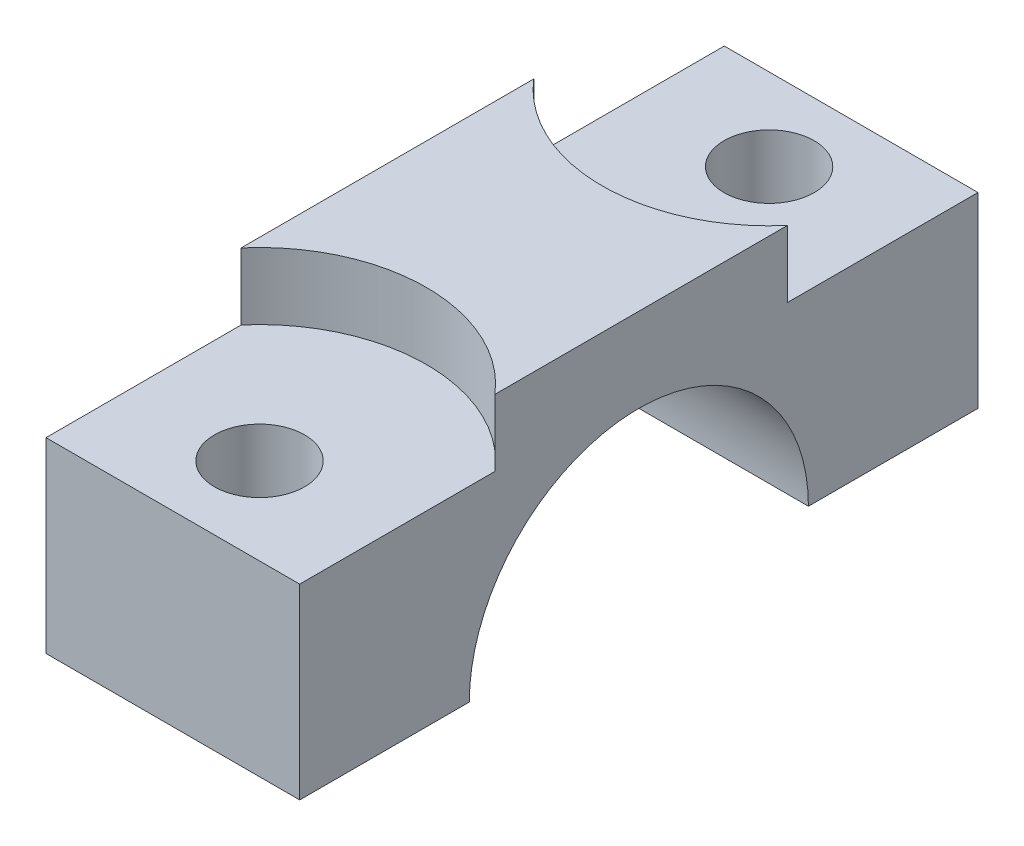
ISO-10303-21;
HEADER;
FILE_DESCRIPTION(('STEP AP214'),'2;1');
FILE_NAME('part.step','',(''),(''),'','','');
FILE_SCHEMA(('AUTOMOTIVE_DESIGN { 1 0 10303 214 1 1 1 1 }'));
ENDSEC;
DATA;
#1=APPLICATION_CONTEXT('core data for automotive mechanical design processes');
#2=APPLICATION_PROTOCOL_DEFINITION('international standard','automotive_design',2000,#1);
#3=PRODUCT_CONTEXT('',#1,'mechanical');
#4=PRODUCT('Part','Part','',(#3));
#5=PRODUCT_RELATED_PRODUCT_CATEGORY('part','',(#4));
#6=PRODUCT_DEFINITION_FORMATION('','',#4);
#7=PRODUCT_DEFINITION_CONTEXT('part definition',#1,'design');
#8=PRODUCT_DEFINITION('design','',#6,#7);
#9=PRODUCT_DEFINITION_SHAPE('','',#8);
#10=(LENGTH_UNIT() NAMED_UNIT(*) SI_UNIT(.MILLI.,.METRE.));
#11=(NAMED_UNIT(*) PLANE_ANGLE_UNIT() SI_UNIT($,.RADIAN.));
#12=(NAMED_UNIT(*) SI_UNIT($,.STERADIAN.) SOLID_ANGLE_UNIT());
#13=UNCERTAINTY_MEASURE_WITH_UNIT(LENGTH_MEASURE(1.E-05),#10,'distance_accuracy_value','');
#14=(GEOMETRIC_REPRESENTATION_CONTEXT(3) GLOBAL_UNCERTAINTY_ASSIGNED_CONTEXT((#13)) GLOBAL_UNIT_ASSIGNED_CONTEXT((#10,
#11,#12)) REPRESENTATION_CONTEXT('',''));
#15=CARTESIAN_POINT('',(0.,0.,0.));
#16=DIRECTION('',(0.,0.,1.));
#17=DIRECTION('',(1.,0.,0.));
#18=AXIS2_PLACEMENT_3D('',#15,#16,#17);
#19=CARTESIAN_POINT('',(9.5,19.,25.4));
#20=DIRECTION('',(0.,-1.,0.));
#21=DIRECTION('',(0.,0.,-1.));
#22=AXIS2_PLACEMENT_3D('',#19,#20,#21);
#23=PLANE('',#22);
#24=DIRECTION('',(0.,0.,1.));
#25=VECTOR('',#24,1.);
#26=CARTESIAN_POINT('',(9.5,19.,25.4));
#27=LINE('',#26,#25);
#28=CARTESIAN_POINT('',(9.5,19.,-11.1304294252436));
#29=VERTEX_POINT('',#28);
#30=CARTESIAN_POINT('',(9.5,19.,10.7841993951461));
#31=VERTEX_POINT('',#30);
#32=EDGE_CURVE('E194',#29,#31,#27,.T.);
#33=ORIENTED_EDGE('',*,*,#32,.F.);
#34=CARTESIAN_POINT('',(0.,19.,-19.2544678298796));
#35=DIRECTION('',(0.,1.,0.));
#36=DIRECTION('',(0.,0.,1.));
#37=AXIS2_PLACEMENT_3D('',#34,#35,#36);
#38=CIRCLE('',#37,12.5);
#39=CARTESIAN_POINT('',(-9.5,19.,-11.1304294252436));
#40=VERTEX_POINT('',#39);
#41=EDGE_CURVE('E247',#40,#29,#38,.T.);
#42=ORIENTED_EDGE('',*,*,#41,.F.);
#43=DIRECTION('',(0.,0.,1.));
#44=VECTOR('',#43,1.);
#45=CARTESIAN_POINT('',(-9.5,19.,25.4));
#46=LINE('',#45,#44);
#47=CARTESIAN_POINT('',(-9.5,19.,10.7841993951461));
#48=VERTEX_POINT('',#47);
#49=EDGE_CURVE('E181',#40,#48,#46,.T.);
#50=ORIENTED_EDGE('',*,*,#49,.T.);
#51=CARTESIAN_POINT('',(0.,19.,18.908237799782));
#52=DIRECTION('',(0.,1.,0.));
#53=DIRECTION('',(0.,0.,1.));
#54=AXIS2_PLACEMENT_3D('',#51,#52,#53);
#55=CIRCLE('',#54,12.5);
#56=EDGE_CURVE('E152',#31,#48,#55,.T.);
#57=ORIENTED_EDGE('',*,*,#56,.F.);
#58=EDGE_LOOP('',(#33,#42,#50,#57));
#59=FACE_BOUND('',#58,.T.);
#60=ADVANCED_FACE('F41',(#59),#23,.F.);
#61=CARTESIAN_POINT('',(9.5,19.,25.4));
#62=DIRECTION('',(0.,0.,-1.));
#63=DIRECTION('',(0.,1.,0.));
#64=AXIS2_PLACEMENT_3D('',#61,#62,#63);
#65=PLANE('',#64);
#66=DIRECTION('',(0.,-1.,0.));
#67=VECTOR('',#66,1.);
#68=CARTESIAN_POINT('',(9.5,19.,25.4));
#69=LINE('',#68,#67);
#70=CARTESIAN_POINT('',(9.5,14.,25.4));
#71=VERTEX_POINT('',#70);
#72=CARTESIAN_POINT('',(9.5,0.,25.4));
#73=VERTEX_POINT('',#72);
#74=EDGE_CURVE('E177',#71,#73,#69,.T.);
#75=ORIENTED_EDGE('',*,*,#74,.F.);
#76=DIRECTION('',(-1.,0.,0.));
#77=VECTOR('',#76,1.);
#78=CARTESIAN_POINT('',(9.5,14.,25.4));
#79=LINE('',#78,#77);
#80=CARTESIAN_POINT('',(-9.5,14.,25.4));
#81=VERTEX_POINT('',#80);
#82=EDGE_CURVE('E169',#71,#81,#79,.T.);
#83=ORIENTED_EDGE('',*,*,#82,.T.);
#84=DIRECTION('',(0.,-1.,0.));
#85=VECTOR('',#84,1.);
#86=CARTESIAN_POINT('',(-9.5,19.,25.4));
#87=LINE('',#86,#85);
#88=CARTESIAN_POINT('',(-9.5,0.,25.4));
#89=VERTEX_POINT('',#88);
#90=EDGE_CURVE('E176',#81,#89,#87,.T.);
#91=ORIENTED_EDGE('',*,*,#90,.T.);
#92=DIRECTION('',(-1.,0.,0.));
#93=VECTOR('',#92,1.);
#94=CARTESIAN_POINT('',(9.5,0.,25.4));
#95=LINE('',#94,#93);
#96=EDGE_CURVE('E226',#73,#89,#95,.T.);
#97=ORIENTED_EDGE('',*,*,#96,.F.);
#98=EDGE_LOOP('',(#75,#83,#91,#97));
#99=FACE_BOUND('',#98,.T.);
#100=ADVANCED_FACE('F43',(#99),#65,.F.);
#101=CARTESIAN_POINT('',(9.5,0.,25.4));
#102=DIRECTION('',(0.,1.,0.));
#103=DIRECTION('',(0.,0.,1.));
#104=AXIS2_PLACEMENT_3D('',#101,#102,#103);
#105=PLANE('',#104);
#106=DIRECTION('',(0.,0.,-1.));
#107=VECTOR('',#106,1.);
#108=CARTESIAN_POINT('',(-9.5,0.,25.4));
#109=LINE('',#108,#107);
#110=CARTESIAN_POINT('',(-9.5,0.,12.7));
#111=VERTEX_POINT('',#110);
#112=EDGE_CURVE('E200',#89,#111,#109,.T.);
#113=ORIENTED_EDGE('',*,*,#112,.T.);
#114=DIRECTION('',(-1.,0.,0.));
#115=VECTOR('',#114,1.);
#116=CARTESIAN_POINT('',(9.5,0.,12.7));
#117=LINE('',#116,#115);
#118=CARTESIAN_POINT('',(9.5,0.,12.7));
#119=VERTEX_POINT('',#118);
#120=EDGE_CURVE('E222',#119,#111,#117,.T.);
#121=ORIENTED_EDGE('',*,*,#120,.F.);
#122=DIRECTION('',(0.,0.,-1.));
#123=VECTOR('',#122,1.);
#124=CARTESIAN_POINT('',(9.5,0.,25.4));
#125=LINE('',#124,#123);
#126=EDGE_CURVE('E180',#73,#119,#125,.T.);
#127=ORIENTED_EDGE('',*,*,#126,.F.);
#128=ORIENTED_EDGE('',*,*,#96,.T.);
#129=EDGE_LOOP('',(#113,#121,#127,#128));
#130=FACE_BOUND('',#129,.T.);
#131=ADVANCED_FACE('F276',(#130),#105,.F.);
#132=CARTESIAN_POINT('',(9.5,0.,0.));
#133=DIRECTION('',(-1.,0.,0.));
#134=DIRECTION('',(0.,0.,1.));
#135=AXIS2_PLACEMENT_3D('',#132,#133,#134);
#136=CYLINDRICAL_SURFACE('',#135,12.7);
#137=CARTESIAN_POINT('',(-9.5,0.,0.));
#138=DIRECTION('',(-1.,0.,0.));
#139=DIRECTION('',(0.,0.,1.));
#140=AXIS2_PLACEMENT_3D('',#137,#138,#139);
#141=CIRCLE('',#140,12.7);
#142=CARTESIAN_POINT('',(-9.5,0.,-12.7));
#143=VERTEX_POINT('',#142);
#144=EDGE_CURVE('E203',#111,#143,#141,.T.);
#145=ORIENTED_EDGE('',*,*,#144,.T.);
#146=DIRECTION('',(-1.,0.,0.));
#147=VECTOR('',#146,1.);
#148=CARTESIAN_POINT('',(9.5,0.,-12.7));
#149=LINE('',#148,#147);
#150=CARTESIAN_POINT('',(9.5,0.,-12.7));
#151=VERTEX_POINT('',#150);
#152=EDGE_CURVE('E218',#151,#143,#149,.T.);
#153=ORIENTED_EDGE('',*,*,#152,.F.);
#154=CARTESIAN_POINT('',(9.5,0.,0.));
#155=DIRECTION('',(-1.,0.,0.));
#156=DIRECTION('',(0.,0.,1.));
#157=AXIS2_PLACEMENT_3D('',#154,#155,#156);
#158=CIRCLE('',#157,12.7);
#159=EDGE_CURVE('E184',#119,#151,#158,.T.);
#160=ORIENTED_EDGE('',*,*,#159,.F.);
#161=ORIENTED_EDGE('',*,*,#120,.T.);
#162=EDGE_LOOP('',(#145,#153,#160,#161));
#163=FACE_BOUND('',#162,.T.);
#164=ADVANCED_FACE('F272',(#163),#136,.F.);
#165=CARTESIAN_POINT('',(9.5,0.,-12.7));
#166=DIRECTION('',(0.,1.,0.));
#167=DIRECTION('',(0.,0.,1.));
#168=AXIS2_PLACEMENT_3D('',#165,#166,#167);
#169=PLANE('',#168);
#170=DIRECTION('',(0.,0.,-1.));
#171=VECTOR('',#170,1.);
#172=CARTESIAN_POINT('',(-9.5,0.,-12.7));
#173=LINE('',#172,#171);
#174=CARTESIAN_POINT('',(-9.5,0.,-25.4));
#175=VERTEX_POINT('',#174);
#176=EDGE_CURVE('E206',#143,#175,#173,.T.);
#177=ORIENTED_EDGE('',*,*,#176,.T.);
#178=DIRECTION('',(-1.,0.,0.));
#179=VECTOR('',#178,1.);
#180=CARTESIAN_POINT('',(9.5,0.,-25.4));
#181=LINE('',#180,#179);
#182=CARTESIAN_POINT('',(9.5,0.,-25.4));
#183=VERTEX_POINT('',#182);
#184=EDGE_CURVE('E197',#183,#175,#181,.T.);
#185=ORIENTED_EDGE('',*,*,#184,.F.);
#186=DIRECTION('',(0.,0.,-1.));
#187=VECTOR('',#186,1.);
#188=CARTESIAN_POINT('',(9.5,0.,-12.7));
#189=LINE('',#188,#187);
#190=EDGE_CURVE('E187',#151,#183,#189,.T.);
#191=ORIENTED_EDGE('',*,*,#190,.F.);
#192=ORIENTED_EDGE('',*,*,#152,.T.);
#193=EDGE_LOOP('',(#177,#185,#191,#192));
#194=FACE_BOUND('',#193,.T.);
#195=ADVANCED_FACE('F267',(#194),#169,.F.);
#196=CARTESIAN_POINT('',(9.5,19.,-25.4));
#197=DIRECTION('',(0.,0.,1.));
#198=DIRECTION('',(0.,-1.,0.));
#199=AXIS2_PLACEMENT_3D('',#196,#197,#198);
#200=PLANE('',#199);
#201=DIRECTION('',(0.,1.,0.));
#202=VECTOR('',#201,1.);
#203=CARTESIAN_POINT('',(-9.5,19.,-25.4));
#204=LINE('',#203,#202);
#205=CARTESIAN_POINT('',(-9.5,14.,-25.4));
#206=VERTEX_POINT('',#205);
#207=EDGE_CURVE('E209',#175,#206,#204,.T.);
#208=ORIENTED_EDGE('',*,*,#207,.T.);
#209=DIRECTION('',(1.,0.,0.));
#210=VECTOR('',#209,1.);
#211=CARTESIAN_POINT('',(9.5,14.,-25.4));
#212=LINE('',#211,#210);
#213=CARTESIAN_POINT('',(9.5,14.,-25.4));
#214=VERTEX_POINT('',#213);
#215=EDGE_CURVE('E57',#206,#214,#212,.T.);
#216=ORIENTED_EDGE('',*,*,#215,.T.);
#217=DIRECTION('',(0.,1.,0.));
#218=VECTOR('',#217,1.);
#219=CARTESIAN_POINT('',(9.5,19.,-25.4));
#220=LINE('',#219,#218);
#221=EDGE_CURVE('E190',#183,#214,#220,.T.);
#222=ORIENTED_EDGE('',*,*,#221,.F.);
#223=ORIENTED_EDGE('',*,*,#184,.T.);
#224=EDGE_LOOP('',(#208,#216,#222,#223));
#225=FACE_BOUND('',#224,.T.);
#226=ADVANCED_FACE('F261',(#225),#200,.F.);
#227=CARTESIAN_POINT('',(9.5,0.,0.));
#228=DIRECTION('',(-1.,0.,0.));
#229=DIRECTION('',(0.,0.,1.));
#230=AXIS2_PLACEMENT_3D('',#227,#228,#229);
#231=PLANE('',#230);
#232=DIRECTION('',(0.,0.,1.));
#233=VECTOR('',#232,1.);
#234=CARTESIAN_POINT('',(9.5,14.,0.));
#235=LINE('',#234,#233);
#236=CARTESIAN_POINT('',(9.5,14.,-11.1304294252436));
#237=VERTEX_POINT('',#236);
#238=EDGE_CURVE('E138',#214,#237,#235,.T.);
#239=ORIENTED_EDGE('',*,*,#238,.T.);
#240=DIRECTION('',(0.,1.,0.));
#241=VECTOR('',#240,1.);
#242=CARTESIAN_POINT('',(9.5,19.,-11.1304294252436));
#243=LINE('',#242,#241);
#244=EDGE_CURVE('E148',#237,#29,#243,.T.);
#245=ORIENTED_EDGE('',*,*,#244,.T.);
#246=ORIENTED_EDGE('',*,*,#32,.T.);
#247=DIRECTION('',(0.,1.,0.));
#248=VECTOR('',#247,1.);
#249=CARTESIAN_POINT('',(9.5,19.,10.7841993951461));
#250=LINE('',#249,#248);
#251=CARTESIAN_POINT('',(9.5,14.,10.7841993951461));
#252=VERTEX_POINT('',#251);
#253=EDGE_CURVE('E230',#31,#252,#250,.F.);
#254=ORIENTED_EDGE('',*,*,#253,.T.);
#255=DIRECTION('',(0.,0.,1.));
#256=VECTOR('',#255,1.);
#257=CARTESIAN_POINT('',(9.5,14.,0.));
#258=LINE('',#257,#256);
#259=EDGE_CURVE('E234',#252,#71,#258,.T.);
#260=ORIENTED_EDGE('',*,*,#259,.T.);
#261=ORIENTED_EDGE('',*,*,#74,.T.);
#262=ORIENTED_EDGE('',*,*,#126,.T.);
#263=ORIENTED_EDGE('',*,*,#159,.T.);
#264=ORIENTED_EDGE('',*,*,#190,.T.);
#265=ORIENTED_EDGE('',*,*,#221,.T.);
#266=EDGE_LOOP('',(#239,#245,#246,#254,#260,#261,#262,#263,#264,#265));
#267=FACE_BOUND('',#266,.T.);
#268=ADVANCED_FACE('F257',(#267),#231,.F.);
#269=CARTESIAN_POINT('',(-9.5,0.,0.));
#270=DIRECTION('',(-1.,0.,0.));
#271=DIRECTION('',(0.,0.,1.));
#272=AXIS2_PLACEMENT_3D('',#269,#270,#271);
#273=PLANE('',#272);
#274=DIRECTION('',(0.,1.,0.));
#275=VECTOR('',#274,1.);
#276=CARTESIAN_POINT('',(-9.5,19.,-11.1304294252436));
#277=LINE('',#276,#275);
#278=CARTESIAN_POINT('',(-9.5,14.,-11.1304294252436));
#279=VERTEX_POINT('',#278);
#280=EDGE_CURVE('E11',#279,#40,#277,.T.);
#281=ORIENTED_EDGE('',*,*,#280,.F.);
#282=DIRECTION('',(0.,0.,1.));
#283=VECTOR('',#282,1.);
#284=CARTESIAN_POINT('',(-9.5,14.,0.));
#285=LINE('',#284,#283);
#286=EDGE_CURVE('E50',#206,#279,#285,.T.);
#287=ORIENTED_EDGE('',*,*,#286,.F.);
#288=ORIENTED_EDGE('',*,*,#207,.F.);
#289=ORIENTED_EDGE('',*,*,#176,.F.);
#290=ORIENTED_EDGE('',*,*,#144,.F.);
#291=ORIENTED_EDGE('',*,*,#112,.F.);
#292=ORIENTED_EDGE('',*,*,#90,.F.);
#293=DIRECTION('',(0.,0.,1.));
#294=VECTOR('',#293,1.);
#295=CARTESIAN_POINT('',(-9.5,14.,0.));
#296=LINE('',#295,#294);
#297=CARTESIAN_POINT('',(-9.5,14.,10.7841993951461));
#298=VERTEX_POINT('',#297);
#299=EDGE_CURVE('E173',#298,#81,#296,.T.);
#300=ORIENTED_EDGE('',*,*,#299,.F.);
#301=DIRECTION('',(0.,1.,0.));
#302=VECTOR('',#301,1.);
#303=CARTESIAN_POINT('',(-9.5,19.,10.7841993951461));
#304=LINE('',#303,#302);
#305=EDGE_CURVE('E166',#48,#298,#304,.F.);
#306=ORIENTED_EDGE('',*,*,#305,.F.);
#307=ORIENTED_EDGE('',*,*,#49,.F.);
#308=EDGE_LOOP('',(#281,#287,#288,#289,#290,#291,#292,#300,#306,#307));
#309=FACE_BOUND('',#308,.T.);
#310=ADVANCED_FACE('F249',(#309),#273,.T.);
#311=CARTESIAN_POINT('',(0.,2.49,18.908237799782));
#312=DIRECTION('',(0.,1.,0.));
#313=DIRECTION('',(0.,0.,1.));
#314=AXIS2_PLACEMENT_3D('',#311,#312,#313);
#315=CONICAL_SURFACE('',#314,3.375,1.02974425867665);
#316=CARTESIAN_POINT('',(0.,0.462095410781981,18.908237799782));
#317=VERTEX_POINT('',#316);
#318=VERTEX_LOOP('',#317);
#319=FACE_BOUND('',#318,.T.);
#320=CARTESIAN_POINT('',(0.,2.49,18.908237799782));
#321=DIRECTION('',(0.,1.,0.));
#322=DIRECTION('',(0.,0.,1.));
#323=AXIS2_PLACEMENT_3D('',#320,#321,#322);
#324=CIRCLE('',#323,3.375);
#325=CARTESIAN_POINT('',(0.,2.49,22.283237799782));
#326=VERTEX_POINT('',#325);
#327=EDGE_CURVE('E162',#326,#326,#324,.T.);
#328=ORIENTED_EDGE('',*,*,#327,.T.);
#329=EDGE_LOOP('',(#328));
#330=FACE_BOUND('',#329,.T.);
#331=ADVANCED_FACE('F289',(#319,#330),#315,.F.);
#332=CARTESIAN_POINT('',(0.,19.,18.908237799782));
#333=DIRECTION('',(0.,1.,0.));
#334=DIRECTION('',(0.,0.,1.));
#335=AXIS2_PLACEMENT_3D('',#332,#333,#334);
#336=CYLINDRICAL_SURFACE('',#335,3.375);
#337=ORIENTED_EDGE('',*,*,#327,.F.);
#338=EDGE_LOOP('',(#337));
#339=FACE_BOUND('',#338,.T.);
#340=CARTESIAN_POINT('',(0.,14.,18.908237799782));
#341=DIRECTION('',(0.,1.,0.));
#342=DIRECTION('',(0.,0.,1.));
#343=AXIS2_PLACEMENT_3D('',#340,#341,#342);
#344=CIRCLE('',#343,3.375);
#345=CARTESIAN_POINT('',(0.,14.,22.283237799782));
#346=VERTEX_POINT('',#345);
#347=EDGE_CURVE('E158',#346,#346,#344,.T.);
#348=ORIENTED_EDGE('',*,*,#347,.T.);
#349=EDGE_LOOP('',(#348));
#350=FACE_BOUND('',#349,.T.);
#351=ADVANCED_FACE('F284',(#339,#350),#336,.F.);
#352=CARTESIAN_POINT('',(3.375,14.,18.908237799782));
#353=DIRECTION('',(0.,-1.,0.));
#354=DIRECTION('',(0.,0.,-1.));
#355=AXIS2_PLACEMENT_3D('',#352,#353,#354);
#356=PLANE('',#355);
#357=ORIENTED_EDGE('',*,*,#299,.T.);
#358=ORIENTED_EDGE('',*,*,#82,.F.);
#359=ORIENTED_EDGE('',*,*,#259,.F.);
#360=CARTESIAN_POINT('',(0.,14.,18.908237799782));
#361=DIRECTION('',(0.,1.,0.));
#362=DIRECTION('',(0.,0.,1.));
#363=AXIS2_PLACEMENT_3D('',#360,#361,#362);
#364=CIRCLE('',#363,12.5);
#365=EDGE_CURVE('E65',#252,#298,#364,.T.);
#366=ORIENTED_EDGE('',*,*,#365,.T.);
#367=EDGE_LOOP('',(#357,#358,#359,#366));
#368=FACE_BOUND('',#367,.T.);
#369=ORIENTED_EDGE('',*,*,#347,.F.);
#370=EDGE_LOOP('',(#369));
#371=FACE_BOUND('',#370,.T.);
#372=ADVANCED_FACE('F281',(#368,#371),#356,.F.);
#373=CARTESIAN_POINT('',(0.,19.,18.908237799782));
#374=DIRECTION('',(0.,1.,0.));
#375=DIRECTION('',(0.,0.,1.));
#376=AXIS2_PLACEMENT_3D('',#373,#374,#375);
#377=CYLINDRICAL_SURFACE('',#376,12.5);
#378=ORIENTED_EDGE('',*,*,#305,.T.);
#379=ORIENTED_EDGE('',*,*,#365,.F.);
#380=ORIENTED_EDGE('',*,*,#253,.F.);
#381=ORIENTED_EDGE('',*,*,#56,.T.);
#382=EDGE_LOOP('',(#378,#379,#380,#381));
#383=FACE_BOUND('',#382,.T.);
#384=ADVANCED_FACE('F255',(#383),#377,.F.);
#385=CARTESIAN_POINT('',(0.,19.,-19.2544678298796));
#386=DIRECTION('',(0.,1.,0.));
#387=DIRECTION('',(0.,0.,1.));
#388=AXIS2_PLACEMENT_3D('',#385,#386,#387);
#389=CYLINDRICAL_SURFACE('',#388,12.5);
#390=CARTESIAN_POINT('',(0.,14.,-19.2544678298796));
#391=DIRECTION('',(0.,1.,0.));
#392=DIRECTION('',(0.,0.,1.));
#393=AXIS2_PLACEMENT_3D('',#390,#391,#392);
#394=CIRCLE('',#393,12.5);
#395=EDGE_CURVE('E141',#279,#237,#394,.T.);
#396=ORIENTED_EDGE('',*,*,#395,.F.);
#397=ORIENTED_EDGE('',*,*,#280,.T.);
#398=ORIENTED_EDGE('',*,*,#41,.T.);
#399=ORIENTED_EDGE('',*,*,#244,.F.);
#400=EDGE_LOOP('',(#396,#397,#398,#399));
#401=FACE_BOUND('',#400,.T.);
#402=ADVANCED_FACE('F244',(#401),#389,.F.);
#403=CARTESIAN_POINT('',(3.375,14.,-19.2544678298796));
#404=DIRECTION('',(0.,-1.,0.));
#405=DIRECTION('',(0.,0.,-1.));
#406=AXIS2_PLACEMENT_3D('',#403,#404,#405);
#407=PLANE('',#406);
#408=CARTESIAN_POINT('',(0.,14.,-19.2544678298796));
#409=DIRECTION('',(0.,1.,0.));
#410=DIRECTION('',(0.,0.,1.));
#411=AXIS2_PLACEMENT_3D('',#408,#409,#410);
#412=CIRCLE('',#411,3.375);
#413=CARTESIAN_POINT('',(0.,14.,-15.8794678298796));
#414=VERTEX_POINT('',#413);
#415=EDGE_CURVE('E134',#414,#414,#412,.T.);
#416=ORIENTED_EDGE('',*,*,#415,.F.);
#417=EDGE_LOOP('',(#416));
#418=FACE_BOUND('',#417,.T.);
#419=ORIENTED_EDGE('',*,*,#215,.F.);
#420=ORIENTED_EDGE('',*,*,#286,.T.);
#421=ORIENTED_EDGE('',*,*,#395,.T.);
#422=ORIENTED_EDGE('',*,*,#238,.F.);
#423=EDGE_LOOP('',(#419,#420,#421,#422));
#424=FACE_BOUND('',#423,.T.);
#425=ADVANCED_FACE('F127',(#418,#424),#407,.F.);
#426=CARTESIAN_POINT('',(0.,2.49,-19.2544678298796));
#427=DIRECTION('',(0.,1.,0.));
#428=DIRECTION('',(0.,0.,1.));
#429=AXIS2_PLACEMENT_3D('',#426,#427,#428);
#430=CONICAL_SURFACE('',#429,3.375,1.02974425867665);
#431=CARTESIAN_POINT('',(0.,0.462095410781981,-19.2544678298796));
#432=VERTEX_POINT('',#431);
#433=VERTEX_LOOP('',#432);
#434=FACE_BOUND('',#433,.T.);
#435=CARTESIAN_POINT('',(0.,2.49,-19.2544678298796));
#436=DIRECTION('',(0.,1.,0.));
#437=DIRECTION('',(0.,0.,1.));
#438=AXIS2_PLACEMENT_3D('',#435,#436,#437);
#439=CIRCLE('',#438,3.375);
#440=CARTESIAN_POINT('',(0.,2.49,-15.8794678298796));
#441=VERTEX_POINT('',#440);
#442=EDGE_CURVE('E131',#441,#441,#439,.T.);
#443=ORIENTED_EDGE('',*,*,#442,.T.);
#444=EDGE_LOOP('',(#443));
#445=FACE_BOUND('',#444,.T.);
#446=ADVANCED_FACE('F123',(#434,#445),#430,.F.);
#447=CARTESIAN_POINT('',(0.,19.,-19.2544678298796));
#448=DIRECTION('',(0.,1.,0.));
#449=DIRECTION('',(0.,0.,1.));
#450=AXIS2_PLACEMENT_3D('',#447,#448,#449);
#451=CYLINDRICAL_SURFACE('',#450,3.375);
#452=ORIENTED_EDGE('',*,*,#442,.F.);
#453=EDGE_LOOP('',(#452));
#454=FACE_BOUND('',#453,.T.);
#455=ORIENTED_EDGE('',*,*,#415,.T.);
#456=EDGE_LOOP('',(#455));
#457=FACE_BOUND('',#456,.T.);
#458=ADVANCED_FACE('F126',(#454,#457),#451,.F.);
#459=CLOSED_SHELL('',(#60,#100,#131,#164,#195,#226,#268,#310,#331,#351,#372,#384,#402,#425,#446,#458));
#460=MANIFOLD_SOLID_BREP('B2',#459);
#461=ADVANCED_BREP_SHAPE_REPRESENTATION('',(#18,#460),#14);
#462=SHAPE_DEFINITION_REPRESENTATION(#9,#461);
ENDSEC;
END-ISO-10303-21;
